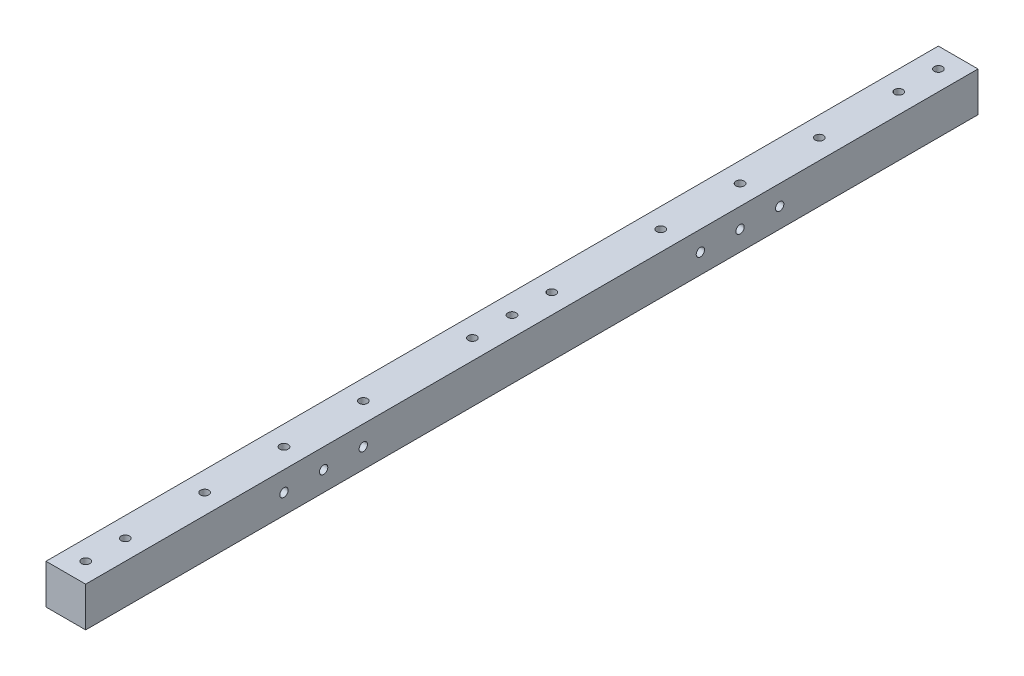
ISO-10303-21;
HEADER;
FILE_DESCRIPTION(('STEP AP214'),'2;1');
FILE_NAME('part.step','',(''),(''),'','','');
FILE_SCHEMA(('AUTOMOTIVE_DESIGN { 1 0 10303 214 1 1 1 1 }'));
ENDSEC;
DATA;
#1=APPLICATION_CONTEXT('core data for automotive mechanical design processes');
#2=APPLICATION_PROTOCOL_DEFINITION('international standard','automotive_design',2000,#1);
#3=PRODUCT_CONTEXT('',#1,'mechanical');
#4=PRODUCT('Part','Part','',(#3));
#5=PRODUCT_RELATED_PRODUCT_CATEGORY('part','',(#4));
#6=PRODUCT_DEFINITION_FORMATION('','',#4);
#7=PRODUCT_DEFINITION_CONTEXT('part definition',#1,'design');
#8=PRODUCT_DEFINITION('design','',#6,#7);
#9=PRODUCT_DEFINITION_SHAPE('','',#8);
#10=(LENGTH_UNIT() NAMED_UNIT(*) SI_UNIT(.MILLI.,.METRE.));
#11=(NAMED_UNIT(*) PLANE_ANGLE_UNIT() SI_UNIT($,.RADIAN.));
#12=(NAMED_UNIT(*) SI_UNIT($,.STERADIAN.) SOLID_ANGLE_UNIT());
#13=UNCERTAINTY_MEASURE_WITH_UNIT(LENGTH_MEASURE(1.E-05),#10,'distance_accuracy_value','');
#14=(GEOMETRIC_REPRESENTATION_CONTEXT(3) GLOBAL_UNCERTAINTY_ASSIGNED_CONTEXT((#13)) GLOBAL_UNIT_ASSIGNED_CONTEXT((#10,
#11,#12)) REPRESENTATION_CONTEXT('',''));
#15=CARTESIAN_POINT('',(0.,0.,0.));
#16=DIRECTION('',(0.,0.,1.));
#17=DIRECTION('',(1.,0.,0.));
#18=AXIS2_PLACEMENT_3D('',#15,#16,#17);
#19=CARTESIAN_POINT('',(10.,10.,450.));
#20=DIRECTION('',(-1.,0.,0.));
#21=DIRECTION('',(0.,0.,1.));
#22=AXIS2_PLACEMENT_3D('',#19,#20,#21);
#23=PLANE('',#22);
#24=CARTESIAN_POINT('',(10.,0.,100.));
#25=DIRECTION('',(1.,0.,0.));
#26=DIRECTION('',(0.,0.,-1.));
#27=AXIS2_PLACEMENT_3D('',#24,#25,#26);
#28=CIRCLE('',#27,2.1);
#29=CARTESIAN_POINT('',(10.,0.,97.9));
#30=VERTEX_POINT('',#29);
#31=EDGE_CURVE('E127',#30,#30,#28,.T.);
#32=ORIENTED_EDGE('',*,*,#31,.F.);
#33=EDGE_LOOP('',(#32));
#34=FACE_BOUND('',#33,.T.);
#35=CARTESIAN_POINT('',(10.,-2.79318507107451E-13,310.));
#36=DIRECTION('',(1.,0.,0.));
#37=DIRECTION('',(0.,0.,1.));
#38=AXIS2_PLACEMENT_3D('',#35,#36,#37);
#39=CIRCLE('',#38,2.09999999999999);
#40=CARTESIAN_POINT('',(10.,-2.79318507107451E-13,312.1));
#41=VERTEX_POINT('',#40);
#42=EDGE_CURVE('E140',#41,#41,#39,.T.);
#43=ORIENTED_EDGE('',*,*,#42,.F.);
#44=EDGE_LOOP('',(#43));
#45=FACE_BOUND('',#44,.T.);
#46=CARTESIAN_POINT('',(10.,0.,350.));
#47=DIRECTION('',(1.,0.,0.));
#48=DIRECTION('',(0.,0.,1.));
#49=AXIS2_PLACEMENT_3D('',#46,#47,#48);
#50=CIRCLE('',#49,2.09999999999999);
#51=CARTESIAN_POINT('',(10.,0.,352.1));
#52=VERTEX_POINT('',#51);
#53=EDGE_CURVE('E121',#52,#52,#50,.T.);
#54=ORIENTED_EDGE('',*,*,#53,.F.);
#55=EDGE_LOOP('',(#54));
#56=FACE_BOUND('',#55,.T.);
#57=CARTESIAN_POINT('',(10.,-1.39659253553725E-13,120.));
#58=DIRECTION('',(1.,0.,0.));
#59=DIRECTION('',(0.,0.,-1.));
#60=AXIS2_PLACEMENT_3D('',#57,#58,#59);
#61=CIRCLE('',#60,2.1);
#62=CARTESIAN_POINT('',(10.,-1.39659253553725E-13,117.9));
#63=VERTEX_POINT('',#62);
#64=EDGE_CURVE('E114',#63,#63,#61,.T.);
#65=ORIENTED_EDGE('',*,*,#64,.F.);
#66=EDGE_LOOP('',(#65));
#67=FACE_BOUND('',#66,.T.);
#68=CARTESIAN_POINT('',(10.,-2.79318507107451E-13,140.));
#69=DIRECTION('',(1.,0.,0.));
#70=DIRECTION('',(0.,0.,-1.));
#71=AXIS2_PLACEMENT_3D('',#68,#69,#70);
#72=CIRCLE('',#71,2.10000000000002);
#73=CARTESIAN_POINT('',(10.,-2.79318507107451E-13,137.9));
#74=VERTEX_POINT('',#73);
#75=EDGE_CURVE('E135',#74,#74,#72,.T.);
#76=ORIENTED_EDGE('',*,*,#75,.F.);
#77=EDGE_LOOP('',(#76));
#78=FACE_BOUND('',#77,.T.);
#79=CARTESIAN_POINT('',(10.,-1.39659253553725E-13,330.));
#80=DIRECTION('',(1.,0.,0.));
#81=DIRECTION('',(0.,0.,1.));
#82=AXIS2_PLACEMENT_3D('',#79,#80,#81);
#83=CIRCLE('',#82,2.09999999999999);
#84=CARTESIAN_POINT('',(10.,-1.39659253553725E-13,332.1));
#85=VERTEX_POINT('',#84);
#86=EDGE_CURVE('E128',#85,#85,#83,.T.);
#87=ORIENTED_EDGE('',*,*,#86,.F.);
#88=EDGE_LOOP('',(#87));
#89=FACE_BOUND('',#88,.T.);
#90=DIRECTION('',(0.,1.,0.));
#91=VECTOR('',#90,1.);
#92=CARTESIAN_POINT('',(10.,10.,0.));
#93=LINE('',#92,#91);
#94=CARTESIAN_POINT('',(10.,-10.,0.));
#95=VERTEX_POINT('',#94);
#96=CARTESIAN_POINT('',(10.,10.,0.));
#97=VERTEX_POINT('',#96);
#98=EDGE_CURVE('E100',#95,#97,#93,.T.);
#99=ORIENTED_EDGE('',*,*,#98,.T.);
#100=DIRECTION('',(0.,0.,-1.));
#101=VECTOR('',#100,1.);
#102=CARTESIAN_POINT('',(10.,10.,450.));
#103=LINE('',#102,#101);
#104=CARTESIAN_POINT('',(10.,10.,450.));
#105=VERTEX_POINT('',#104);
#106=EDGE_CURVE('E11',#105,#97,#103,.T.);
#107=ORIENTED_EDGE('',*,*,#106,.F.);
#108=DIRECTION('',(0.,1.,0.));
#109=VECTOR('',#108,1.);
#110=CARTESIAN_POINT('',(10.,10.,450.));
#111=LINE('',#110,#109);
#112=CARTESIAN_POINT('',(10.,-10.,450.));
#113=VERTEX_POINT('',#112);
#114=EDGE_CURVE('E88',#113,#105,#111,.T.);
#115=ORIENTED_EDGE('',*,*,#114,.F.);
#116=DIRECTION('',(0.,0.,-1.));
#117=VECTOR('',#116,1.);
#118=CARTESIAN_POINT('',(10.,-10.,450.));
#119=LINE('',#118,#117);
#120=EDGE_CURVE('E96',#113,#95,#119,.T.);
#121=ORIENTED_EDGE('',*,*,#120,.T.);
#122=EDGE_LOOP('',(#99,#107,#115,#121));
#123=FACE_BOUND('',#122,.T.);
#124=ADVANCED_FACE('F37',(#34,#45,#56,#67,#78,#89,#123),#23,.F.);
#125=CARTESIAN_POINT('',(-10.,10.,450.));
#126=DIRECTION('',(0.,-1.,0.));
#127=DIRECTION('',(0.,0.,-1.));
#128=AXIS2_PLACEMENT_3D('',#125,#126,#127);
#129=PLANE('',#128);
#130=CARTESIAN_POINT('',(0.,10.,10.));
#131=DIRECTION('',(0.,1.,0.));
#132=DIRECTION('',(0.,0.,1.));
#133=AXIS2_PLACEMENT_3D('',#130,#131,#132);
#134=CIRCLE('',#133,2.1);
#135=CARTESIAN_POINT('',(0.,10.,12.1));
#136=VERTEX_POINT('',#135);
#137=EDGE_CURVE('E181',#136,#136,#134,.T.);
#138=ORIENTED_EDGE('',*,*,#137,.F.);
#139=EDGE_LOOP('',(#138));
#140=FACE_BOUND('',#139,.T.);
#141=CARTESIAN_POINT('',(1.24958540118864E-12,10.,300.));
#142=DIRECTION('',(0.,1.,0.));
#143=DIRECTION('',(0.,0.,-1.));
#144=AXIS2_PLACEMENT_3D('',#141,#142,#143);
#145=CIRCLE('',#144,2.09999999999998);
#146=CARTESIAN_POINT('',(1.24958540118864E-12,10.,297.9));
#147=VERTEX_POINT('',#146);
#148=EDGE_CURVE('E218',#147,#147,#145,.T.);
#149=ORIENTED_EDGE('',*,*,#148,.F.);
#150=EDGE_LOOP('',(#149));
#151=FACE_BOUND('',#150,.T.);
#152=CARTESIAN_POINT('',(4.16528467062881E-13,10.,70.));
#153=DIRECTION('',(0.,1.,0.));
#154=DIRECTION('',(0.,0.,1.));
#155=AXIS2_PLACEMENT_3D('',#152,#153,#154);
#156=CIRCLE('',#155,2.1);
#157=CARTESIAN_POINT('',(4.16528467062881E-13,10.,72.1));
#158=VERTEX_POINT('',#157);
#159=EDGE_CURVE('E182',#158,#158,#156,.T.);
#160=ORIENTED_EDGE('',*,*,#159,.F.);
#161=EDGE_LOOP('',(#160));
#162=FACE_BOUND('',#161,.T.);
#163=CARTESIAN_POINT('',(0.,10.,420.));
#164=DIRECTION('',(0.,1.,0.));
#165=DIRECTION('',(0.,0.,-1.));
#166=AXIS2_PLACEMENT_3D('',#163,#164,#165);
#167=CIRCLE('',#166,2.09999999999998);
#168=CARTESIAN_POINT('',(0.,10.,417.9));
#169=VERTEX_POINT('',#168);
#170=EDGE_CURVE('E189',#169,#169,#167,.T.);
#171=ORIENTED_EDGE('',*,*,#170,.F.);
#172=EDGE_LOOP('',(#171));
#173=FACE_BOUND('',#172,.T.);
#174=CARTESIAN_POINT('',(0.,10.,440.));
#175=DIRECTION('',(0.,1.,0.));
#176=DIRECTION('',(0.,0.,-1.));
#177=AXIS2_PLACEMENT_3D('',#174,#175,#176);
#178=CIRCLE('',#177,2.10000000000001);
#179=CARTESIAN_POINT('',(0.,10.,437.9));
#180=VERTEX_POINT('',#179);
#181=EDGE_CURVE('E168',#180,#180,#178,.T.);
#182=ORIENTED_EDGE('',*,*,#181,.F.);
#183=EDGE_LOOP('',(#182));
#184=FACE_BOUND('',#183,.T.);
#185=CARTESIAN_POINT('',(0.,10.,30.));
#186=DIRECTION('',(0.,1.,0.));
#187=DIRECTION('',(0.,0.,1.));
#188=AXIS2_PLACEMENT_3D('',#185,#186,#187);
#189=CIRCLE('',#188,2.1);
#190=CARTESIAN_POINT('',(0.,10.,32.1));
#191=VERTEX_POINT('',#190);
#192=EDGE_CURVE('E175',#191,#191,#189,.T.);
#193=ORIENTED_EDGE('',*,*,#192,.F.);
#194=EDGE_LOOP('',(#193));
#195=FACE_BOUND('',#194,.T.);
#196=CARTESIAN_POINT('',(8.33056934125763E-13,10.,110.));
#197=DIRECTION('',(0.,1.,0.));
#198=DIRECTION('',(0.,0.,1.));
#199=AXIS2_PLACEMENT_3D('',#196,#197,#198);
#200=CIRCLE('',#199,2.1);
#201=CARTESIAN_POINT('',(8.33056934125763E-13,10.,112.1));
#202=VERTEX_POINT('',#201);
#203=EDGE_CURVE('E213',#202,#202,#200,.T.);
#204=ORIENTED_EDGE('',*,*,#203,.F.);
#205=EDGE_LOOP('',(#204));
#206=FACE_BOUND('',#205,.T.);
#207=CARTESIAN_POINT('',(1.24958540118864E-12,10.,150.));
#208=DIRECTION('',(0.,1.,0.));
#209=DIRECTION('',(0.,0.,1.));
#210=AXIS2_PLACEMENT_3D('',#207,#208,#209);
#211=CIRCLE('',#210,2.1);
#212=CARTESIAN_POINT('',(1.24958540118864E-12,10.,152.1));
#213=VERTEX_POINT('',#212);
#214=EDGE_CURVE('E207',#213,#213,#211,.T.);
#215=ORIENTED_EDGE('',*,*,#214,.F.);
#216=EDGE_LOOP('',(#215));
#217=FACE_BOUND('',#216,.T.);
#218=CARTESIAN_POINT('',(4.16528467062881E-13,10.,380.));
#219=DIRECTION('',(0.,1.,0.));
#220=DIRECTION('',(0.,0.,-1.));
#221=AXIS2_PLACEMENT_3D('',#218,#219,#220);
#222=CIRCLE('',#221,2.10000000000002);
#223=CARTESIAN_POINT('',(4.16528467062881E-13,10.,377.9));
#224=VERTEX_POINT('',#223);
#225=EDGE_CURVE('E201',#224,#224,#222,.T.);
#226=ORIENTED_EDGE('',*,*,#225,.F.);
#227=EDGE_LOOP('',(#226));
#228=FACE_BOUND('',#227,.T.);
#229=CARTESIAN_POINT('',(8.33056934125763E-13,10.,340.));
#230=DIRECTION('',(0.,1.,0.));
#231=DIRECTION('',(0.,0.,-1.));
#232=AXIS2_PLACEMENT_3D('',#229,#230,#231);
#233=CIRCLE('',#232,2.1);
#234=CARTESIAN_POINT('',(8.33056934125763E-13,10.,337.9));
#235=VERTEX_POINT('',#234);
#236=EDGE_CURVE('E194',#235,#235,#233,.T.);
#237=ORIENTED_EDGE('',*,*,#236,.F.);
#238=EDGE_LOOP('',(#237));
#239=FACE_BOUND('',#238,.T.);
#240=CARTESIAN_POINT('',(0.,10.,245.));
#241=DIRECTION('',(0.,1.,0.));
#242=DIRECTION('',(0.,0.,1.));
#243=AXIS2_PLACEMENT_3D('',#240,#241,#242);
#244=CIRCLE('',#243,2.1);
#245=CARTESIAN_POINT('',(0.,10.,247.1));
#246=VERTEX_POINT('',#245);
#247=EDGE_CURVE('E163',#246,#246,#244,.T.);
#248=ORIENTED_EDGE('',*,*,#247,.F.);
#249=EDGE_LOOP('',(#248));
#250=FACE_BOUND('',#249,.T.);
#251=CARTESIAN_POINT('',(-1.06768896449205E-13,10.,225.));
#252=DIRECTION('',(0.,1.,0.));
#253=DIRECTION('',(0.,0.,1.));
#254=AXIS2_PLACEMENT_3D('',#251,#252,#253);
#255=CIRCLE('',#254,2.1);
#256=CARTESIAN_POINT('',(-1.06768896449205E-13,10.,227.1));
#257=VERTEX_POINT('',#256);
#258=EDGE_CURVE('E157',#257,#257,#255,.T.);
#259=ORIENTED_EDGE('',*,*,#258,.F.);
#260=EDGE_LOOP('',(#259));
#261=FACE_BOUND('',#260,.T.);
#262=CARTESIAN_POINT('',(-1.7537387642692E-13,10.,205.));
#263=DIRECTION('',(0.,1.,0.));
#264=DIRECTION('',(0.,0.,1.));
#265=AXIS2_PLACEMENT_3D('',#262,#263,#264);
#266=CIRCLE('',#265,2.1);
#267=CARTESIAN_POINT('',(-1.7537387642692E-13,10.,207.1));
#268=VERTEX_POINT('',#267);
#269=EDGE_CURVE('E150',#268,#268,#266,.T.);
#270=ORIENTED_EDGE('',*,*,#269,.F.);
#271=EDGE_LOOP('',(#270));
#272=FACE_BOUND('',#271,.T.);
#273=DIRECTION('',(-1.,0.,0.));
#274=VECTOR('',#273,1.);
#275=CARTESIAN_POINT('',(-10.,10.,0.));
#276=LINE('',#275,#274);
#277=CARTESIAN_POINT('',(-10.,10.,0.));
#278=VERTEX_POINT('',#277);
#279=EDGE_CURVE('E92',#97,#278,#276,.T.);
#280=ORIENTED_EDGE('',*,*,#279,.T.);
#281=DIRECTION('',(0.,0.,-1.));
#282=VECTOR('',#281,1.);
#283=CARTESIAN_POINT('',(-10.,10.,450.));
#284=LINE('',#283,#282);
#285=CARTESIAN_POINT('',(-10.,10.,450.));
#286=VERTEX_POINT('',#285);
#287=EDGE_CURVE('E45',#286,#278,#284,.T.);
#288=ORIENTED_EDGE('',*,*,#287,.F.);
#289=DIRECTION('',(-1.,0.,0.));
#290=VECTOR('',#289,1.);
#291=CARTESIAN_POINT('',(-10.,10.,450.));
#292=LINE('',#291,#290);
#293=EDGE_CURVE('E83',#105,#286,#292,.T.);
#294=ORIENTED_EDGE('',*,*,#293,.F.);
#295=ORIENTED_EDGE('',*,*,#106,.T.);
#296=EDGE_LOOP('',(#280,#288,#294,#295));
#297=FACE_BOUND('',#296,.T.);
#298=ADVANCED_FACE('F91',(#140,#151,#162,#173,#184,#195,#206,#217,#228,#239,#250,#261,#272,
#297),#129,.F.);
#299=CARTESIAN_POINT('',(-10.,10.,450.));
#300=DIRECTION('',(1.,0.,0.));
#301=DIRECTION('',(0.,1.,0.));
#302=AXIS2_PLACEMENT_3D('',#299,#300,#301);
#303=PLANE('',#302);
#304=CARTESIAN_POINT('',(-10.,0.,100.));
#305=DIRECTION('',(1.,0.,0.));
#306=DIRECTION('',(0.,0.,-1.));
#307=AXIS2_PLACEMENT_3D('',#304,#305,#306);
#308=CIRCLE('',#307,2.1);
#309=CARTESIAN_POINT('',(-10.,0.,97.9));
#310=VERTEX_POINT('',#309);
#311=EDGE_CURVE('E103',#310,#310,#308,.T.);
#312=ORIENTED_EDGE('',*,*,#311,.T.);
#313=EDGE_LOOP('',(#312));
#314=FACE_BOUND('',#313,.T.);
#315=CARTESIAN_POINT('',(-10.,-2.79318507107451E-13,310.));
#316=DIRECTION('',(1.,0.,0.));
#317=DIRECTION('',(0.,0.,1.));
#318=AXIS2_PLACEMENT_3D('',#315,#316,#317);
#319=CIRCLE('',#318,2.09999999999999);
#320=CARTESIAN_POINT('',(-10.,-2.79318507107451E-13,312.1));
#321=VERTEX_POINT('',#320);
#322=EDGE_CURVE('E132',#321,#321,#319,.T.);
#323=ORIENTED_EDGE('',*,*,#322,.T.);
#324=EDGE_LOOP('',(#323));
#325=FACE_BOUND('',#324,.T.);
#326=CARTESIAN_POINT('',(-10.,0.,350.));
#327=DIRECTION('',(1.,0.,0.));
#328=DIRECTION('',(0.,0.,1.));
#329=AXIS2_PLACEMENT_3D('',#326,#327,#328);
#330=CIRCLE('',#329,2.09999999999999);
#331=CARTESIAN_POINT('',(-10.,0.,352.1));
#332=VERTEX_POINT('',#331);
#333=EDGE_CURVE('E124',#332,#332,#330,.T.);
#334=ORIENTED_EDGE('',*,*,#333,.T.);
#335=EDGE_LOOP('',(#334));
#336=FACE_BOUND('',#335,.T.);
#337=CARTESIAN_POINT('',(-10.,-1.39659253553725E-13,120.));
#338=DIRECTION('',(1.,0.,0.));
#339=DIRECTION('',(0.,0.,-1.));
#340=AXIS2_PLACEMENT_3D('',#337,#338,#339);
#341=CIRCLE('',#340,2.1);
#342=CARTESIAN_POINT('',(-10.,-1.39659253553725E-13,117.9));
#343=VERTEX_POINT('',#342);
#344=EDGE_CURVE('E117',#343,#343,#341,.T.);
#345=ORIENTED_EDGE('',*,*,#344,.T.);
#346=EDGE_LOOP('',(#345));
#347=FACE_BOUND('',#346,.T.);
#348=CARTESIAN_POINT('',(-10.,-2.79318507107451E-13,140.));
#349=DIRECTION('',(1.,0.,0.));
#350=DIRECTION('',(0.,0.,-1.));
#351=AXIS2_PLACEMENT_3D('',#348,#349,#350);
#352=CIRCLE('',#351,2.10000000000002);
#353=CARTESIAN_POINT('',(-10.,-2.79318507107451E-13,137.9));
#354=VERTEX_POINT('',#353);
#355=EDGE_CURVE('E118',#354,#354,#352,.T.);
#356=ORIENTED_EDGE('',*,*,#355,.T.);
#357=EDGE_LOOP('',(#356));
#358=FACE_BOUND('',#357,.T.);
#359=CARTESIAN_POINT('',(-10.,-1.39659253553725E-13,330.));
#360=DIRECTION('',(1.,0.,0.));
#361=DIRECTION('',(0.,0.,1.));
#362=AXIS2_PLACEMENT_3D('',#359,#360,#361);
#363=CIRCLE('',#362,2.09999999999999);
#364=CARTESIAN_POINT('',(-10.,-1.39659253553725E-13,332.1));
#365=VERTEX_POINT('',#364);
#366=EDGE_CURVE('E131',#365,#365,#363,.T.);
#367=ORIENTED_EDGE('',*,*,#366,.T.);
#368=EDGE_LOOP('',(#367));
#369=FACE_BOUND('',#368,.T.);
#370=DIRECTION('',(0.,-1.,0.));
#371=VECTOR('',#370,1.);
#372=CARTESIAN_POINT('',(-10.,10.,0.));
#373=LINE('',#372,#371);
#374=CARTESIAN_POINT('',(-10.,-10.,0.));
#375=VERTEX_POINT('',#374);
#376=EDGE_CURVE('E70',#278,#375,#373,.T.);
#377=ORIENTED_EDGE('',*,*,#376,.T.);
#378=DIRECTION('',(0.,0.,-1.));
#379=VECTOR('',#378,1.);
#380=CARTESIAN_POINT('',(-10.,-10.,450.));
#381=LINE('',#380,#379);
#382=CARTESIAN_POINT('',(-10.,-10.,450.));
#383=VERTEX_POINT('',#382);
#384=EDGE_CURVE('E93',#383,#375,#381,.T.);
#385=ORIENTED_EDGE('',*,*,#384,.F.);
#386=DIRECTION('',(0.,-1.,0.));
#387=VECTOR('',#386,1.);
#388=CARTESIAN_POINT('',(-10.,10.,450.));
#389=LINE('',#388,#387);
#390=EDGE_CURVE('E86',#286,#383,#389,.T.);
#391=ORIENTED_EDGE('',*,*,#390,.F.);
#392=ORIENTED_EDGE('',*,*,#287,.T.);
#393=EDGE_LOOP('',(#377,#385,#391,#392));
#394=FACE_BOUND('',#393,.T.);
#395=ADVANCED_FACE('F94',(#314,#325,#336,#347,#358,#369,#394),#303,.F.);
#396=CARTESIAN_POINT('',(-10.,-10.,450.));
#397=DIRECTION('',(0.,1.,0.));
#398=DIRECTION('',(0.,0.,1.));
#399=AXIS2_PLACEMENT_3D('',#396,#397,#398);
#400=PLANE('',#399);
#401=CARTESIAN_POINT('',(0.,-10.,10.));
#402=DIRECTION('',(0.,1.,0.));
#403=DIRECTION('',(0.,0.,1.));
#404=AXIS2_PLACEMENT_3D('',#401,#402,#403);
#405=CIRCLE('',#404,2.1);
#406=CARTESIAN_POINT('',(0.,-10.,12.1));
#407=VERTEX_POINT('',#406);
#408=EDGE_CURVE('E154',#407,#407,#405,.T.);
#409=ORIENTED_EDGE('',*,*,#408,.T.);
#410=EDGE_LOOP('',(#409));
#411=FACE_BOUND('',#410,.T.);
#412=CARTESIAN_POINT('',(1.24958540118864E-12,-10.,300.));
#413=DIRECTION('',(0.,1.,0.));
#414=DIRECTION('',(0.,0.,-1.));
#415=AXIS2_PLACEMENT_3D('',#412,#413,#414);
#416=CIRCLE('',#415,2.09999999999998);
#417=CARTESIAN_POINT('',(1.24958540118864E-12,-10.,297.9));
#418=VERTEX_POINT('',#417);
#419=EDGE_CURVE('E198',#418,#418,#416,.T.);
#420=ORIENTED_EDGE('',*,*,#419,.T.);
#421=EDGE_LOOP('',(#420));
#422=FACE_BOUND('',#421,.T.);
#423=CARTESIAN_POINT('',(4.16528467062881E-13,-10.,70.));
#424=DIRECTION('',(0.,1.,0.));
#425=DIRECTION('',(0.,0.,1.));
#426=AXIS2_PLACEMENT_3D('',#423,#424,#425);
#427=CIRCLE('',#426,2.1);
#428=CARTESIAN_POINT('',(4.16528467062881E-13,-10.,72.1));
#429=VERTEX_POINT('',#428);
#430=EDGE_CURVE('E185',#429,#429,#427,.T.);
#431=ORIENTED_EDGE('',*,*,#430,.T.);
#432=EDGE_LOOP('',(#431));
#433=FACE_BOUND('',#432,.T.);
#434=CARTESIAN_POINT('',(0.,-10.,420.));
#435=DIRECTION('',(0.,1.,0.));
#436=DIRECTION('',(0.,0.,-1.));
#437=AXIS2_PLACEMENT_3D('',#434,#435,#436);
#438=CIRCLE('',#437,2.09999999999998);
#439=CARTESIAN_POINT('',(0.,-10.,417.9));
#440=VERTEX_POINT('',#439);
#441=EDGE_CURVE('E172',#440,#440,#438,.T.);
#442=ORIENTED_EDGE('',*,*,#441,.T.);
#443=EDGE_LOOP('',(#442));
#444=FACE_BOUND('',#443,.T.);
#445=CARTESIAN_POINT('',(0.,-10.,440.));
#446=DIRECTION('',(0.,1.,0.));
#447=DIRECTION('',(0.,0.,-1.));
#448=AXIS2_PLACEMENT_3D('',#445,#446,#447);
#449=CIRCLE('',#448,2.10000000000001);
#450=CARTESIAN_POINT('',(0.,-10.,437.9));
#451=VERTEX_POINT('',#450);
#452=EDGE_CURVE('E171',#451,#451,#449,.T.);
#453=ORIENTED_EDGE('',*,*,#452,.T.);
#454=EDGE_LOOP('',(#453));
#455=FACE_BOUND('',#454,.T.);
#456=CARTESIAN_POINT('',(0.,-10.,30.));
#457=DIRECTION('',(0.,1.,0.));
#458=DIRECTION('',(0.,0.,1.));
#459=AXIS2_PLACEMENT_3D('',#456,#457,#458);
#460=CIRCLE('',#459,2.1);
#461=CARTESIAN_POINT('',(0.,-10.,32.1));
#462=VERTEX_POINT('',#461);
#463=EDGE_CURVE('E178',#462,#462,#460,.T.);
#464=ORIENTED_EDGE('',*,*,#463,.T.);
#465=EDGE_LOOP('',(#464));
#466=FACE_BOUND('',#465,.T.);
#467=CARTESIAN_POINT('',(8.33056934125763E-13,-10.,110.));
#468=DIRECTION('',(0.,1.,0.));
#469=DIRECTION('',(0.,0.,1.));
#470=AXIS2_PLACEMENT_3D('',#467,#468,#469);
#471=CIRCLE('',#470,2.1);
#472=CARTESIAN_POINT('',(8.33056934125763E-13,-10.,112.1));
#473=VERTEX_POINT('',#472);
#474=EDGE_CURVE('E186',#473,#473,#471,.T.);
#475=ORIENTED_EDGE('',*,*,#474,.T.);
#476=EDGE_LOOP('',(#475));
#477=FACE_BOUND('',#476,.T.);
#478=CARTESIAN_POINT('',(1.24958540118864E-12,-10.,150.));
#479=DIRECTION('',(0.,1.,0.));
#480=DIRECTION('',(0.,0.,1.));
#481=AXIS2_PLACEMENT_3D('',#478,#479,#480);
#482=CIRCLE('',#481,2.1);
#483=CARTESIAN_POINT('',(1.24958540118864E-12,-10.,152.1));
#484=VERTEX_POINT('',#483);
#485=EDGE_CURVE('E210',#484,#484,#482,.T.);
#486=ORIENTED_EDGE('',*,*,#485,.T.);
#487=EDGE_LOOP('',(#486));
#488=FACE_BOUND('',#487,.T.);
#489=CARTESIAN_POINT('',(4.16528467062881E-13,-10.,380.));
#490=DIRECTION('',(0.,1.,0.));
#491=DIRECTION('',(0.,0.,-1.));
#492=AXIS2_PLACEMENT_3D('',#489,#490,#491);
#493=CIRCLE('',#492,2.10000000000002);
#494=CARTESIAN_POINT('',(4.16528467062881E-13,-10.,377.9));
#495=VERTEX_POINT('',#494);
#496=EDGE_CURVE('E204',#495,#495,#493,.T.);
#497=ORIENTED_EDGE('',*,*,#496,.T.);
#498=EDGE_LOOP('',(#497));
#499=FACE_BOUND('',#498,.T.);
#500=CARTESIAN_POINT('',(8.33056934125763E-13,-10.,340.));
#501=DIRECTION('',(0.,1.,0.));
#502=DIRECTION('',(0.,0.,-1.));
#503=AXIS2_PLACEMENT_3D('',#500,#501,#502);
#504=CIRCLE('',#503,2.1);
#505=CARTESIAN_POINT('',(8.33056934125763E-13,-10.,337.9));
#506=VERTEX_POINT('',#505);
#507=EDGE_CURVE('E197',#506,#506,#504,.T.);
#508=ORIENTED_EDGE('',*,*,#507,.T.);
#509=EDGE_LOOP('',(#508));
#510=FACE_BOUND('',#509,.T.);
#511=CARTESIAN_POINT('',(0.,-10.,245.));
#512=DIRECTION('',(0.,1.,0.));
#513=DIRECTION('',(0.,0.,1.));
#514=AXIS2_PLACEMENT_3D('',#511,#512,#513);
#515=CIRCLE('',#514,2.1);
#516=CARTESIAN_POINT('',(0.,-10.,247.1));
#517=VERTEX_POINT('',#516);
#518=EDGE_CURVE('E143',#517,#517,#515,.T.);
#519=ORIENTED_EDGE('',*,*,#518,.T.);
#520=EDGE_LOOP('',(#519));
#521=FACE_BOUND('',#520,.T.);
#522=CARTESIAN_POINT('',(-1.06768896449205E-13,-10.,225.));
#523=DIRECTION('',(0.,1.,0.));
#524=DIRECTION('',(0.,0.,1.));
#525=AXIS2_PLACEMENT_3D('',#522,#523,#524);
#526=CIRCLE('',#525,2.1);
#527=CARTESIAN_POINT('',(-1.06768896449205E-13,-10.,227.1));
#528=VERTEX_POINT('',#527);
#529=EDGE_CURVE('E160',#528,#528,#526,.T.);
#530=ORIENTED_EDGE('',*,*,#529,.T.);
#531=EDGE_LOOP('',(#530));
#532=FACE_BOUND('',#531,.T.);
#533=CARTESIAN_POINT('',(-1.7537387642692E-13,-10.,205.));
#534=DIRECTION('',(0.,1.,0.));
#535=DIRECTION('',(0.,0.,1.));
#536=AXIS2_PLACEMENT_3D('',#533,#534,#535);
#537=CIRCLE('',#536,2.1);
#538=CARTESIAN_POINT('',(-1.7537387642692E-13,-10.,207.1));
#539=VERTEX_POINT('',#538);
#540=EDGE_CURVE('E153',#539,#539,#537,.T.);
#541=ORIENTED_EDGE('',*,*,#540,.T.);
#542=EDGE_LOOP('',(#541));
#543=FACE_BOUND('',#542,.T.);
#544=DIRECTION('',(1.,0.,0.));
#545=VECTOR('',#544,1.);
#546=CARTESIAN_POINT('',(-10.,-10.,0.));
#547=LINE('',#546,#545);
#548=EDGE_CURVE('E76',#375,#95,#547,.T.);
#549=ORIENTED_EDGE('',*,*,#548,.T.);
#550=ORIENTED_EDGE('',*,*,#120,.F.);
#551=DIRECTION('',(1.,0.,0.));
#552=VECTOR('',#551,1.);
#553=CARTESIAN_POINT('',(-10.,-10.,450.));
#554=LINE('',#553,#552);
#555=EDGE_CURVE('E53',#383,#113,#554,.T.);
#556=ORIENTED_EDGE('',*,*,#555,.F.);
#557=ORIENTED_EDGE('',*,*,#384,.T.);
#558=EDGE_LOOP('',(#549,#550,#556,#557));
#559=FACE_BOUND('',#558,.T.);
#560=ADVANCED_FACE('F108',(#411,#422,#433,#444,#455,#466,#477,#488,#499,#510,#521,#532,#543,
#559),#400,.F.);
#561=CARTESIAN_POINT('',(0.,0.,450.));
#562=DIRECTION('',(0.,0.,1.));
#563=DIRECTION('',(1.,0.,0.));
#564=AXIS2_PLACEMENT_3D('',#561,#562,#563);
#565=PLANE('',#564);
#566=ORIENTED_EDGE('',*,*,#114,.T.);
#567=ORIENTED_EDGE('',*,*,#293,.T.);
#568=ORIENTED_EDGE('',*,*,#390,.T.);
#569=ORIENTED_EDGE('',*,*,#555,.T.);
#570=EDGE_LOOP('',(#566,#567,#568,#569));
#571=FACE_BOUND('',#570,.T.);
#572=ADVANCED_FACE('F84',(#571),#565,.T.);
#573=CARTESIAN_POINT('',(0.,0.,0.));
#574=DIRECTION('',(0.,0.,1.));
#575=DIRECTION('',(1.,0.,0.));
#576=AXIS2_PLACEMENT_3D('',#573,#574,#575);
#577=PLANE('',#576);
#578=ORIENTED_EDGE('',*,*,#98,.F.);
#579=ORIENTED_EDGE('',*,*,#548,.F.);
#580=ORIENTED_EDGE('',*,*,#376,.F.);
#581=ORIENTED_EDGE('',*,*,#279,.F.);
#582=EDGE_LOOP('',(#578,#579,#580,#581));
#583=FACE_BOUND('',#582,.T.);
#584=ADVANCED_FACE('F111',(#583),#577,.F.);
#585=CARTESIAN_POINT('',(-10.,-1.39659253553725E-13,330.));
#586=DIRECTION('',(1.,0.,0.));
#587=DIRECTION('',(0.,0.,-1.));
#588=AXIS2_PLACEMENT_3D('',#585,#586,#587);
#589=CYLINDRICAL_SURFACE('',#588,2.09999999999999);
#590=ORIENTED_EDGE('',*,*,#366,.F.);
#591=EDGE_LOOP('',(#590));
#592=FACE_BOUND('',#591,.T.);
#593=ORIENTED_EDGE('',*,*,#86,.T.);
#594=EDGE_LOOP('',(#593));
#595=FACE_BOUND('',#594,.T.);
#596=ADVANCED_FACE('F296',(#592,#595),#589,.F.);
#597=CARTESIAN_POINT('',(-10.,-2.79318507107451E-13,140.));
#598=DIRECTION('',(1.,0.,0.));
#599=DIRECTION('',(0.,0.,-1.));
#600=AXIS2_PLACEMENT_3D('',#597,#598,#599);
#601=CYLINDRICAL_SURFACE('',#600,2.10000000000002);
#602=ORIENTED_EDGE('',*,*,#355,.F.);
#603=EDGE_LOOP('',(#602));
#604=FACE_BOUND('',#603,.T.);
#605=ORIENTED_EDGE('',*,*,#75,.T.);
#606=EDGE_LOOP('',(#605));
#607=FACE_BOUND('',#606,.T.);
#608=ADVANCED_FACE('F298',(#604,#607),#601,.F.);
#609=CARTESIAN_POINT('',(-10.,-1.39659253553725E-13,120.));
#610=DIRECTION('',(1.,0.,0.));
#611=DIRECTION('',(0.,0.,-1.));
#612=AXIS2_PLACEMENT_3D('',#609,#610,#611);
#613=CYLINDRICAL_SURFACE('',#612,2.1);
#614=ORIENTED_EDGE('',*,*,#344,.F.);
#615=EDGE_LOOP('',(#614));
#616=FACE_BOUND('',#615,.T.);
#617=ORIENTED_EDGE('',*,*,#64,.T.);
#618=EDGE_LOOP('',(#617));
#619=FACE_BOUND('',#618,.T.);
#620=ADVANCED_FACE('F305',(#616,#619),#613,.F.);
#621=CARTESIAN_POINT('',(-10.,0.,350.));
#622=DIRECTION('',(1.,0.,0.));
#623=DIRECTION('',(0.,0.,-1.));
#624=AXIS2_PLACEMENT_3D('',#621,#622,#623);
#625=CYLINDRICAL_SURFACE('',#624,2.09999999999999);
#626=ORIENTED_EDGE('',*,*,#333,.F.);
#627=EDGE_LOOP('',(#626));
#628=FACE_BOUND('',#627,.T.);
#629=ORIENTED_EDGE('',*,*,#53,.T.);
#630=EDGE_LOOP('',(#629));
#631=FACE_BOUND('',#630,.T.);
#632=ADVANCED_FACE('F312',(#628,#631),#625,.F.);
#633=CARTESIAN_POINT('',(-10.,-2.79318507107451E-13,310.));
#634=DIRECTION('',(1.,0.,0.));
#635=DIRECTION('',(0.,0.,-1.));
#636=AXIS2_PLACEMENT_3D('',#633,#634,#635);
#637=CYLINDRICAL_SURFACE('',#636,2.09999999999999);
#638=ORIENTED_EDGE('',*,*,#322,.F.);
#639=EDGE_LOOP('',(#638));
#640=FACE_BOUND('',#639,.T.);
#641=ORIENTED_EDGE('',*,*,#42,.T.);
#642=EDGE_LOOP('',(#641));
#643=FACE_BOUND('',#642,.T.);
#644=ADVANCED_FACE('F276',(#640,#643),#637,.F.);
#645=CARTESIAN_POINT('',(-10.,0.,100.));
#646=DIRECTION('',(1.,0.,0.));
#647=DIRECTION('',(0.,0.,-1.));
#648=AXIS2_PLACEMENT_3D('',#645,#646,#647);
#649=CYLINDRICAL_SURFACE('',#648,2.1);
#650=ORIENTED_EDGE('',*,*,#311,.F.);
#651=EDGE_LOOP('',(#650));
#652=FACE_BOUND('',#651,.T.);
#653=ORIENTED_EDGE('',*,*,#31,.T.);
#654=EDGE_LOOP('',(#653));
#655=FACE_BOUND('',#654,.T.);
#656=ADVANCED_FACE('F266',(#652,#655),#649,.F.);
#657=CARTESIAN_POINT('',(-1.7537387642692E-13,-10.,205.));
#658=DIRECTION('',(0.,1.,0.));
#659=DIRECTION('',(0.,0.,1.));
#660=AXIS2_PLACEMENT_3D('',#657,#658,#659);
#661=CYLINDRICAL_SURFACE('',#660,2.1);
#662=ORIENTED_EDGE('',*,*,#540,.F.);
#663=EDGE_LOOP('',(#662));
#664=FACE_BOUND('',#663,.T.);
#665=ORIENTED_EDGE('',*,*,#269,.T.);
#666=EDGE_LOOP('',(#665));
#667=FACE_BOUND('',#666,.T.);
#668=ADVANCED_FACE('F263',(#664,#667),#661,.F.);
#669=CARTESIAN_POINT('',(-1.06768896449205E-13,-10.,225.));
#670=DIRECTION('',(0.,1.,0.));
#671=DIRECTION('',(0.,0.,1.));
#672=AXIS2_PLACEMENT_3D('',#669,#670,#671);
#673=CYLINDRICAL_SURFACE('',#672,2.1);
#674=ORIENTED_EDGE('',*,*,#529,.F.);
#675=EDGE_LOOP('',(#674));
#676=FACE_BOUND('',#675,.T.);
#677=ORIENTED_EDGE('',*,*,#258,.T.);
#678=EDGE_LOOP('',(#677));
#679=FACE_BOUND('',#678,.T.);
#680=ADVANCED_FACE('F265',(#676,#679),#673,.F.);
#681=CARTESIAN_POINT('',(0.,-10.,245.));
#682=DIRECTION('',(0.,1.,0.));
#683=DIRECTION('',(0.,0.,1.));
#684=AXIS2_PLACEMENT_3D('',#681,#682,#683);
#685=CYLINDRICAL_SURFACE('',#684,2.1);
#686=ORIENTED_EDGE('',*,*,#518,.F.);
#687=EDGE_LOOP('',(#686));
#688=FACE_BOUND('',#687,.T.);
#689=ORIENTED_EDGE('',*,*,#247,.T.);
#690=EDGE_LOOP('',(#689));
#691=FACE_BOUND('',#690,.T.);
#692=ADVANCED_FACE('F273',(#688,#691),#685,.F.);
#693=CARTESIAN_POINT('',(8.33056934125763E-13,-10.,340.));
#694=DIRECTION('',(0.,1.,0.));
#695=DIRECTION('',(0.,0.,1.));
#696=AXIS2_PLACEMENT_3D('',#693,#694,#695);
#697=CYLINDRICAL_SURFACE('',#696,2.1);
#698=ORIENTED_EDGE('',*,*,#507,.F.);
#699=EDGE_LOOP('',(#698));
#700=FACE_BOUND('',#699,.T.);
#701=ORIENTED_EDGE('',*,*,#236,.T.);
#702=EDGE_LOOP('',(#701));
#703=FACE_BOUND('',#702,.T.);
#704=ADVANCED_FACE('F370',(#700,#703),#697,.F.);
#705=CARTESIAN_POINT('',(4.16528467062881E-13,-10.,380.));
#706=DIRECTION('',(0.,1.,0.));
#707=DIRECTION('',(0.,0.,1.));
#708=AXIS2_PLACEMENT_3D('',#705,#706,#707);
#709=CYLINDRICAL_SURFACE('',#708,2.10000000000002);
#710=ORIENTED_EDGE('',*,*,#496,.F.);
#711=EDGE_LOOP('',(#710));
#712=FACE_BOUND('',#711,.T.);
#713=ORIENTED_EDGE('',*,*,#225,.T.);
#714=EDGE_LOOP('',(#713));
#715=FACE_BOUND('',#714,.T.);
#716=ADVANCED_FACE('F395',(#712,#715),#709,.F.);
#717=CARTESIAN_POINT('',(1.24958540118864E-12,-10.,150.));
#718=DIRECTION('',(0.,1.,0.));
#719=DIRECTION('',(0.,0.,1.));
#720=AXIS2_PLACEMENT_3D('',#717,#718,#719);
#721=CYLINDRICAL_SURFACE('',#720,2.1);
#722=ORIENTED_EDGE('',*,*,#485,.F.);
#723=EDGE_LOOP('',(#722));
#724=FACE_BOUND('',#723,.T.);
#725=ORIENTED_EDGE('',*,*,#214,.T.);
#726=EDGE_LOOP('',(#725));
#727=FACE_BOUND('',#726,.T.);
#728=ADVANCED_FACE('F405',(#724,#727),#721,.F.);
#729=CARTESIAN_POINT('',(8.33056934125763E-13,-10.,110.));
#730=DIRECTION('',(0.,1.,0.));
#731=DIRECTION('',(0.,0.,1.));
#732=AXIS2_PLACEMENT_3D('',#729,#730,#731);
#733=CYLINDRICAL_SURFACE('',#732,2.1);
#734=ORIENTED_EDGE('',*,*,#474,.F.);
#735=EDGE_LOOP('',(#734));
#736=FACE_BOUND('',#735,.T.);
#737=ORIENTED_EDGE('',*,*,#203,.T.);
#738=EDGE_LOOP('',(#737));
#739=FACE_BOUND('',#738,.T.);
#740=ADVANCED_FACE('F415',(#736,#739),#733,.F.);
#741=CARTESIAN_POINT('',(0.,-10.,30.));
#742=DIRECTION('',(0.,1.,0.));
#743=DIRECTION('',(0.,0.,1.));
#744=AXIS2_PLACEMENT_3D('',#741,#742,#743);
#745=CYLINDRICAL_SURFACE('',#744,2.1);
#746=ORIENTED_EDGE('',*,*,#463,.F.);
#747=EDGE_LOOP('',(#746));
#748=FACE_BOUND('',#747,.T.);
#749=ORIENTED_EDGE('',*,*,#192,.T.);
#750=EDGE_LOOP('',(#749));
#751=FACE_BOUND('',#750,.T.);
#752=ADVANCED_FACE('F425',(#748,#751),#745,.F.);
#753=CARTESIAN_POINT('',(0.,-10.,440.));
#754=DIRECTION('',(0.,1.,0.));
#755=DIRECTION('',(0.,0.,1.));
#756=AXIS2_PLACEMENT_3D('',#753,#754,#755);
#757=CYLINDRICAL_SURFACE('',#756,2.10000000000001);
#758=ORIENTED_EDGE('',*,*,#452,.F.);
#759=EDGE_LOOP('',(#758));
#760=FACE_BOUND('',#759,.T.);
#761=ORIENTED_EDGE('',*,*,#181,.T.);
#762=EDGE_LOOP('',(#761));
#763=FACE_BOUND('',#762,.T.);
#764=ADVANCED_FACE('F435',(#760,#763),#757,.F.);
#765=CARTESIAN_POINT('',(0.,-10.,420.));
#766=DIRECTION('',(0.,1.,0.));
#767=DIRECTION('',(0.,0.,1.));
#768=AXIS2_PLACEMENT_3D('',#765,#766,#767);
#769=CYLINDRICAL_SURFACE('',#768,2.09999999999998);
#770=ORIENTED_EDGE('',*,*,#441,.F.);
#771=EDGE_LOOP('',(#770));
#772=FACE_BOUND('',#771,.T.);
#773=ORIENTED_EDGE('',*,*,#170,.T.);
#774=EDGE_LOOP('',(#773));
#775=FACE_BOUND('',#774,.T.);
#776=ADVANCED_FACE('F445',(#772,#775),#769,.F.);
#777=CARTESIAN_POINT('',(4.16528467062881E-13,-10.,70.));
#778=DIRECTION('',(0.,1.,0.));
#779=DIRECTION('',(0.,0.,1.));
#780=AXIS2_PLACEMENT_3D('',#777,#778,#779);
#781=CYLINDRICAL_SURFACE('',#780,2.1);
#782=ORIENTED_EDGE('',*,*,#430,.F.);
#783=EDGE_LOOP('',(#782));
#784=FACE_BOUND('',#783,.T.);
#785=ORIENTED_EDGE('',*,*,#159,.T.);
#786=EDGE_LOOP('',(#785));
#787=FACE_BOUND('',#786,.T.);
#788=ADVANCED_FACE('F455',(#784,#787),#781,.F.);
#789=CARTESIAN_POINT('',(1.24958540118864E-12,-10.,300.));
#790=DIRECTION('',(0.,1.,0.));
#791=DIRECTION('',(0.,0.,1.));
#792=AXIS2_PLACEMENT_3D('',#789,#790,#791);
#793=CYLINDRICAL_SURFACE('',#792,2.09999999999998);
#794=ORIENTED_EDGE('',*,*,#419,.F.);
#795=EDGE_LOOP('',(#794));
#796=FACE_BOUND('',#795,.T.);
#797=ORIENTED_EDGE('',*,*,#148,.T.);
#798=EDGE_LOOP('',(#797));
#799=FACE_BOUND('',#798,.T.);
#800=ADVANCED_FACE('F233',(#796,#799),#793,.F.);
#801=CARTESIAN_POINT('',(0.,-10.,10.));
#802=DIRECTION('',(0.,1.,0.));
#803=DIRECTION('',(0.,0.,1.));
#804=AXIS2_PLACEMENT_3D('',#801,#802,#803);
#805=CYLINDRICAL_SURFACE('',#804,2.1);
#806=ORIENTED_EDGE('',*,*,#408,.F.);
#807=EDGE_LOOP('',(#806));
#808=FACE_BOUND('',#807,.T.);
#809=ORIENTED_EDGE('',*,*,#137,.T.);
#810=EDGE_LOOP('',(#809));
#811=FACE_BOUND('',#810,.T.);
#812=ADVANCED_FACE('F230',(#808,#811),#805,.F.);
#813=CLOSED_SHELL('',(#124,#298,#395,#560,#572,#584,#596,#608,#620,#632,#644,#656,#668,#680,
#692,#704,#716,#728,#740,#752,#764,#776,#788,#800,#812));
#814=MANIFOLD_SOLID_BREP('B2',#813);
#815=ADVANCED_BREP_SHAPE_REPRESENTATION('',(#18,#814),#14);
#816=SHAPE_DEFINITION_REPRESENTATION(#9,#815);
ENDSEC;
END-ISO-10303-21;
